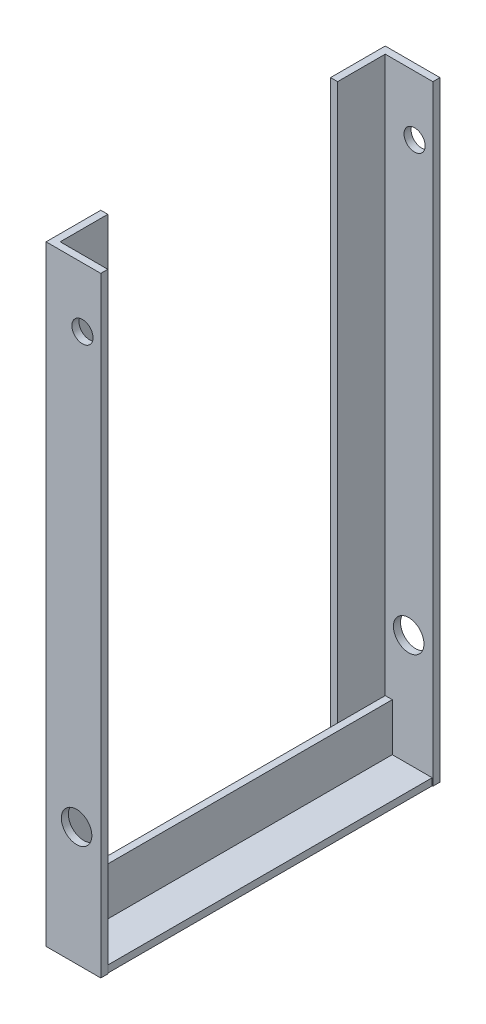
ISO-10303-21;
HEADER;
FILE_DESCRIPTION(('STEP AP214'),'2;1');
FILE_NAME('part.step','',(''),(''),'','','');
FILE_SCHEMA(('AUTOMOTIVE_DESIGN { 1 0 10303 214 1 1 1 1 }'));
ENDSEC;
DATA;
#1=APPLICATION_CONTEXT('core data for automotive mechanical design processes');
#2=APPLICATION_PROTOCOL_DEFINITION('international standard','automotive_design',2000,#1);
#3=PRODUCT_CONTEXT('',#1,'mechanical');
#4=PRODUCT('Part','Part','',(#3));
#5=PRODUCT_RELATED_PRODUCT_CATEGORY('part','',(#4));
#6=PRODUCT_DEFINITION_FORMATION('','',#4);
#7=PRODUCT_DEFINITION_CONTEXT('part definition',#1,'design');
#8=PRODUCT_DEFINITION('design','',#6,#7);
#9=PRODUCT_DEFINITION_SHAPE('','',#8);
#10=(LENGTH_UNIT() NAMED_UNIT(*) SI_UNIT(.MILLI.,.METRE.));
#11=(NAMED_UNIT(*) PLANE_ANGLE_UNIT() SI_UNIT($,.RADIAN.));
#12=(NAMED_UNIT(*) SI_UNIT($,.STERADIAN.) SOLID_ANGLE_UNIT());
#13=UNCERTAINTY_MEASURE_WITH_UNIT(LENGTH_MEASURE(1.E-05),#10,'distance_accuracy_value','');
#14=(GEOMETRIC_REPRESENTATION_CONTEXT(3) GLOBAL_UNCERTAINTY_ASSIGNED_CONTEXT((#13)) GLOBAL_UNIT_ASSIGNED_CONTEXT((#10,
#11,#12)) REPRESENTATION_CONTEXT('',''));
#15=CARTESIAN_POINT('',(0.,0.,0.));
#16=DIRECTION('',(0.,0.,1.));
#17=DIRECTION('',(1.,0.,0.));
#18=AXIS2_PLACEMENT_3D('',#15,#16,#17);
#19=CARTESIAN_POINT('',(6.00000000000002,0.,0.));
#20=DIRECTION('',(-1.,0.,0.));
#21=DIRECTION('',(0.,-1.,0.));
#22=AXIS2_PLACEMENT_3D('',#19,#20,#21);
#23=PLANE('',#22);
#24=DIRECTION('',(0.,0.,1.));
#25=VECTOR('',#24,1.);
#26=CARTESIAN_POINT('',(6.00000000000003,-127.,1.49999999999997));
#27=LINE('',#26,#25);
#28=CARTESIAN_POINT('',(6.00000000000003,-127.,1.49999999999997));
#29=VERTEX_POINT('',#28);
#30=CARTESIAN_POINT('',(6.00000000000003,-127.,140.));
#31=VERTEX_POINT('',#30);
#32=EDGE_CURVE('E168',#29,#31,#27,.T.);
#33=ORIENTED_EDGE('',*,*,#32,.F.);
#34=DIRECTION('',(0.,-1.,0.));
#35=VECTOR('',#34,1.);
#36=CARTESIAN_POINT('',(6.00000000000002,0.,1.5));
#37=LINE('',#36,#35);
#38=CARTESIAN_POINT('',(6.00000000000003,-106.7,1.49999999999997));
#39=VERTEX_POINT('',#38);
#40=EDGE_CURVE('E11',#39,#29,#37,.T.);
#41=ORIENTED_EDGE('',*,*,#40,.F.);
#42=DIRECTION('',(0.,0.,1.));
#43=VECTOR('',#42,1.);
#44=CARTESIAN_POINT('',(6.00000000000003,-106.7,143.));
#45=LINE('',#44,#43);
#46=CARTESIAN_POINT('',(6.00000000000003,-106.7,140.));
#47=VERTEX_POINT('',#46);
#48=EDGE_CURVE('E202',#39,#47,#45,.T.);
#49=ORIENTED_EDGE('',*,*,#48,.T.);
#50=DIRECTION('',(0.,1.,0.));
#51=VECTOR('',#50,1.);
#52=CARTESIAN_POINT('',(6.00000000000002,0.,140.));
#53=LINE('',#52,#51);
#54=EDGE_CURVE('E42',#31,#47,#53,.T.);
#55=ORIENTED_EDGE('',*,*,#54,.F.);
#56=EDGE_LOOP('',(#33,#41,#49,#55));
#57=FACE_BOUND('',#56,.T.);
#58=ADVANCED_FACE('F33',(#57),#23,.F.);
#59=CARTESIAN_POINT('',(0.,0.,140.));
#60=DIRECTION('',(0.,0.,-1.));
#61=DIRECTION('',(-1.,0.,0.));
#62=AXIS2_PLACEMENT_3D('',#59,#60,#61);
#63=PLANE('',#62);
#64=CARTESIAN_POINT('',(15.5,104.6,140.));
#65=DIRECTION('',(0.,0.,-1.));
#66=DIRECTION('',(-1.,0.,0.));
#67=AXIS2_PLACEMENT_3D('',#64,#65,#66);
#68=CIRCLE('',#67,4.5);
#69=CARTESIAN_POINT('',(11.,104.6,140.));
#70=VERTEX_POINT('',#69);
#71=EDGE_CURVE('E327',#70,#70,#68,.T.);
#72=ORIENTED_EDGE('',*,*,#71,.F.);
#73=EDGE_LOOP('',(#72));
#74=FACE_BOUND('',#73,.T.);
#75=CARTESIAN_POINT('',(13.,-79.4000000000002,140.));
#76=DIRECTION('',(0.,0.,-1.));
#77=DIRECTION('',(-1.,0.,0.));
#78=AXIS2_PLACEMENT_3D('',#75,#76,#77);
#79=CIRCLE('',#78,6.50000000000002);
#80=CARTESIAN_POINT('',(6.49999999999998,-79.4000000000002,140.));
#81=VERTEX_POINT('',#80);
#82=EDGE_CURVE('E312',#81,#81,#79,.T.);
#83=ORIENTED_EDGE('',*,*,#82,.F.);
#84=EDGE_LOOP('',(#83));
#85=FACE_BOUND('',#84,.T.);
#86=DIRECTION('',(0.,-1.,0.));
#87=VECTOR('',#86,1.);
#88=CARTESIAN_POINT('',(23.,-130.,140.));
#89=LINE('',#88,#87);
#90=CARTESIAN_POINT('',(23.,-127.,140.));
#91=VERTEX_POINT('',#90);
#92=CARTESIAN_POINT('',(23.,-130.,140.));
#93=VERTEX_POINT('',#92);
#94=EDGE_CURVE('E162',#91,#93,#89,.T.);
#95=ORIENTED_EDGE('',*,*,#94,.F.);
#96=DIRECTION('',(-1.,0.,0.));
#97=VECTOR('',#96,1.);
#98=CARTESIAN_POINT('',(23.,-127.,140.));
#99=LINE('',#98,#97);
#100=EDGE_CURVE('E160',#91,#31,#99,.T.);
#101=ORIENTED_EDGE('',*,*,#100,.T.);
#102=ORIENTED_EDGE('',*,*,#54,.T.);
#103=DIRECTION('',(-1.,0.,0.));
#104=VECTOR('',#103,1.);
#105=CARTESIAN_POINT('',(0.,-106.7,140.));
#106=LINE('',#105,#104);
#107=CARTESIAN_POINT('',(3.00000000000003,-106.7,140.));
#108=VERTEX_POINT('',#107);
#109=EDGE_CURVE('E212',#47,#108,#106,.T.);
#110=ORIENTED_EDGE('',*,*,#109,.T.);
#111=DIRECTION('',(0.,-1.,0.));
#112=VECTOR('',#111,1.);
#113=CARTESIAN_POINT('',(3.00000000000002,0.,140.));
#114=LINE('',#113,#112);
#115=CARTESIAN_POINT('',(3.,130.,140.));
#116=VERTEX_POINT('',#115);
#117=EDGE_CURVE('E256',#116,#108,#114,.T.);
#118=ORIENTED_EDGE('',*,*,#117,.F.);
#119=DIRECTION('',(-1.,0.,0.));
#120=VECTOR('',#119,1.);
#121=CARTESIAN_POINT('',(0.,130.,140.));
#122=LINE('',#121,#120);
#123=CARTESIAN_POINT('',(23.3,130.,140.));
#124=VERTEX_POINT('',#123);
#125=EDGE_CURVE('E243',#124,#116,#122,.T.);
#126=ORIENTED_EDGE('',*,*,#125,.F.);
#127=DIRECTION('',(0.,1.,0.));
#128=VECTOR('',#127,1.);
#129=CARTESIAN_POINT('',(23.3,-130.,140.));
#130=LINE('',#129,#128);
#131=CARTESIAN_POINT('',(23.3,-130.,140.));
#132=VERTEX_POINT('',#131);
#133=EDGE_CURVE('E229',#132,#124,#130,.T.);
#134=ORIENTED_EDGE('',*,*,#133,.F.);
#135=DIRECTION('',(1.,0.,0.));
#136=VECTOR('',#135,1.);
#137=CARTESIAN_POINT('',(0.,-130.,140.));
#138=LINE('',#137,#136);
#139=EDGE_CURVE('E234',#93,#132,#138,.T.);
#140=ORIENTED_EDGE('',*,*,#139,.F.);
#141=EDGE_LOOP('',(#95,#101,#102,#110,#118,#126,#134,#140));
#142=FACE_BOUND('',#141,.T.);
#143=ADVANCED_FACE('F261',(#74,#85,#142),#63,.T.);
#144=CARTESIAN_POINT('',(3.,130.,1.50000000000001));
#145=DIRECTION('',(0.,0.,-1.));
#146=DIRECTION('',(0.,1.,0.));
#147=AXIS2_PLACEMENT_3D('',#144,#145,#146);
#148=PLANE('',#147);
#149=CARTESIAN_POINT('',(13.,-79.4000000000002,1.49999999999997));
#150=DIRECTION('',(0.,0.,-1.));
#151=DIRECTION('',(0.,1.,0.));
#152=AXIS2_PLACEMENT_3D('',#149,#150,#151);
#153=CIRCLE('',#152,6.50000000000002);
#154=CARTESIAN_POINT('',(13.,-72.9000000000002,1.49999999999997));
#155=VERTEX_POINT('',#154);
#156=EDGE_CURVE('E314',#155,#155,#153,.T.);
#157=ORIENTED_EDGE('',*,*,#156,.T.);
#158=EDGE_LOOP('',(#157));
#159=FACE_BOUND('',#158,.T.);
#160=CARTESIAN_POINT('',(15.5,104.6,1.50000000000001));
#161=DIRECTION('',(0.,0.,-1.));
#162=DIRECTION('',(0.,1.,0.));
#163=AXIS2_PLACEMENT_3D('',#160,#161,#162);
#164=CIRCLE('',#163,4.5);
#165=CARTESIAN_POINT('',(15.5,109.1,1.50000000000001));
#166=VERTEX_POINT('',#165);
#167=EDGE_CURVE('E597',#166,#166,#164,.F.);
#168=ORIENTED_EDGE('',*,*,#167,.F.);
#169=EDGE_LOOP('',(#168));
#170=FACE_BOUND('',#169,.T.);
#171=DIRECTION('',(-1.,0.,0.));
#172=VECTOR('',#171,1.);
#173=CARTESIAN_POINT('',(23.,-127.,1.49999999999997));
#174=LINE('',#173,#172);
#175=CARTESIAN_POINT('',(23.,-127.,1.49999999999997));
#176=VERTEX_POINT('',#175);
#177=EDGE_CURVE('E157',#176,#29,#174,.T.);
#178=ORIENTED_EDGE('',*,*,#177,.F.);
#179=DIRECTION('',(0.,1.,0.));
#180=VECTOR('',#179,1.);
#181=CARTESIAN_POINT('',(23.,-130.,1.49999999999997));
#182=LINE('',#181,#180);
#183=CARTESIAN_POINT('',(23.,-130.,1.49999999999998));
#184=VERTEX_POINT('',#183);
#185=EDGE_CURVE('E163',#184,#176,#182,.T.);
#186=ORIENTED_EDGE('',*,*,#185,.F.);
#187=DIRECTION('',(-1.,0.,0.));
#188=VECTOR('',#187,1.);
#189=CARTESIAN_POINT('',(3.,-130.,1.49999999999998));
#190=LINE('',#189,#188);
#191=CARTESIAN_POINT('',(23.3,-130.,1.49999999999998));
#192=VERTEX_POINT('',#191);
#193=EDGE_CURVE('E309',#192,#184,#190,.T.);
#194=ORIENTED_EDGE('',*,*,#193,.F.);
#195=DIRECTION('',(0.,-1.,0.));
#196=VECTOR('',#195,1.);
#197=CARTESIAN_POINT('',(23.3,130.,1.50000000000001));
#198=LINE('',#197,#196);
#199=CARTESIAN_POINT('',(23.3,130.,1.50000000000001));
#200=VERTEX_POINT('',#199);
#201=EDGE_CURVE('E602',#200,#192,#198,.T.);
#202=ORIENTED_EDGE('',*,*,#201,.F.);
#203=DIRECTION('',(-1.,0.,0.));
#204=VECTOR('',#203,1.);
#205=CARTESIAN_POINT('',(3.,130.,1.50000000000001));
#206=LINE('',#205,#204);
#207=CARTESIAN_POINT('',(3.,130.,1.5));
#208=VERTEX_POINT('',#207);
#209=EDGE_CURVE('E587',#200,#208,#206,.T.);
#210=ORIENTED_EDGE('',*,*,#209,.T.);
#211=DIRECTION('',(0.,1.,0.));
#212=VECTOR('',#211,1.);
#213=CARTESIAN_POINT('',(3.,130.,1.5));
#214=LINE('',#213,#212);
#215=CARTESIAN_POINT('',(3.00000000000003,-106.7,1.5));
#216=VERTEX_POINT('',#215);
#217=EDGE_CURVE('E172',#216,#208,#214,.T.);
#218=ORIENTED_EDGE('',*,*,#217,.F.);
#219=DIRECTION('',(1.,0.,0.));
#220=VECTOR('',#219,1.);
#221=CARTESIAN_POINT('',(6.00000000000003,-106.7,1.49999999999997));
#222=LINE('',#221,#220);
#223=EDGE_CURVE('E198',#216,#39,#222,.T.);
#224=ORIENTED_EDGE('',*,*,#223,.T.);
#225=ORIENTED_EDGE('',*,*,#40,.T.);
#226=EDGE_LOOP('',(#178,#186,#194,#202,#210,#218,#224,#225));
#227=FACE_BOUND('',#226,.T.);
#228=ADVANCED_FACE('F170',(#159,#170,#227),#148,.F.);
#229=CARTESIAN_POINT('',(6.00000000000003,-106.7,143.));
#230=DIRECTION('',(0.,-1.,0.));
#231=DIRECTION('',(1.,0.,0.));
#232=AXIS2_PLACEMENT_3D('',#229,#230,#231);
#233=PLANE('',#232);
#234=ORIENTED_EDGE('',*,*,#223,.F.);
#235=DIRECTION('',(0.,0.,1.));
#236=VECTOR('',#235,1.);
#237=CARTESIAN_POINT('',(3.00000000000003,-106.7,143.));
#238=LINE('',#237,#236);
#239=CARTESIAN_POINT('',(3.00000000000003,-106.7,21.8));
#240=VERTEX_POINT('',#239);
#241=EDGE_CURVE('E206',#216,#240,#238,.T.);
#242=ORIENTED_EDGE('',*,*,#241,.T.);
#243=CARTESIAN_POINT('',(3.00000000000003,-106.7,119.7));
#244=VERTEX_POINT('',#243);
#245=EDGE_CURVE('E209',#240,#244,#238,.T.);
#246=ORIENTED_EDGE('',*,*,#245,.T.);
#247=EDGE_CURVE('E208',#244,#108,#238,.T.);
#248=ORIENTED_EDGE('',*,*,#247,.T.);
#249=ORIENTED_EDGE('',*,*,#109,.F.);
#250=ORIENTED_EDGE('',*,*,#48,.F.);
#251=EDGE_LOOP('',(#234,#242,#246,#248,#249,#250));
#252=FACE_BOUND('',#251,.T.);
#253=ADVANCED_FACE('F268',(#252),#233,.F.);
#254=CARTESIAN_POINT('',(3.,130.,119.7));
#255=DIRECTION('',(1.,0.,0.));
#256=DIRECTION('',(0.,1.,0.));
#257=AXIS2_PLACEMENT_3D('',#254,#255,#256);
#258=PLANE('',#257);
#259=ORIENTED_EDGE('',*,*,#117,.T.);
#260=ORIENTED_EDGE('',*,*,#247,.F.);
#261=DIRECTION('',(0.,1.,0.));
#262=VECTOR('',#261,1.);
#263=CARTESIAN_POINT('',(3.,130.,119.7));
#264=LINE('',#263,#262);
#265=CARTESIAN_POINT('',(3.,130.,119.7));
#266=VERTEX_POINT('',#265);
#267=EDGE_CURVE('E220',#244,#266,#264,.T.);
#268=ORIENTED_EDGE('',*,*,#267,.T.);
#269=DIRECTION('',(0.,0.,1.));
#270=VECTOR('',#269,1.);
#271=CARTESIAN_POINT('',(3.,130.,119.7));
#272=LINE('',#271,#270);
#273=EDGE_CURVE('E227',#266,#116,#272,.T.);
#274=ORIENTED_EDGE('',*,*,#273,.T.);
#275=EDGE_LOOP('',(#259,#260,#268,#274));
#276=FACE_BOUND('',#275,.T.);
#277=ADVANCED_FACE('F297',(#276),#258,.T.);
#278=CARTESIAN_POINT('',(23.3,-130.,143.));
#279=DIRECTION('',(-1.,0.,0.));
#280=DIRECTION('',(0.,0.,1.));
#281=AXIS2_PLACEMENT_3D('',#278,#279,#280);
#282=PLANE('',#281);
#283=ORIENTED_EDGE('',*,*,#133,.T.);
#284=DIRECTION('',(0.,0.,-1.));
#285=VECTOR('',#284,1.);
#286=CARTESIAN_POINT('',(23.3,130.,143.));
#287=LINE('',#286,#285);
#288=CARTESIAN_POINT('',(23.3,130.,143.));
#289=VERTEX_POINT('',#288);
#290=EDGE_CURVE('E253',#289,#124,#287,.T.);
#291=ORIENTED_EDGE('',*,*,#290,.F.);
#292=DIRECTION('',(0.,1.,0.));
#293=VECTOR('',#292,1.);
#294=CARTESIAN_POINT('',(23.3,-130.,143.));
#295=LINE('',#294,#293);
#296=CARTESIAN_POINT('',(23.3,-130.,143.));
#297=VERTEX_POINT('',#296);
#298=EDGE_CURVE('E230',#297,#289,#295,.T.);
#299=ORIENTED_EDGE('',*,*,#298,.F.);
#300=DIRECTION('',(0.,0.,-1.));
#301=VECTOR('',#300,1.);
#302=CARTESIAN_POINT('',(23.3,-130.,143.));
#303=LINE('',#302,#301);
#304=EDGE_CURVE('E240',#297,#132,#303,.T.);
#305=ORIENTED_EDGE('',*,*,#304,.T.);
#306=EDGE_LOOP('',(#283,#291,#299,#305));
#307=FACE_BOUND('',#306,.T.);
#308=ADVANCED_FACE('F35',(#307),#282,.F.);
#309=CARTESIAN_POINT('',(0.,130.,143.));
#310=DIRECTION('',(0.,-1.,0.));
#311=DIRECTION('',(0.,0.,-1.));
#312=AXIS2_PLACEMENT_3D('',#309,#310,#311);
#313=PLANE('',#312);
#314=ORIENTED_EDGE('',*,*,#125,.T.);
#315=ORIENTED_EDGE('',*,*,#273,.F.);
#316=DIRECTION('',(-1.,0.,0.));
#317=VECTOR('',#316,1.);
#318=CARTESIAN_POINT('',(0.,130.,119.7));
#319=LINE('',#318,#317);
#320=CARTESIAN_POINT('',(0.,130.,119.7));
#321=VERTEX_POINT('',#320);
#322=EDGE_CURVE('E224',#266,#321,#319,.T.);
#323=ORIENTED_EDGE('',*,*,#322,.T.);
#324=DIRECTION('',(0.,0.,-1.));
#325=VECTOR('',#324,1.);
#326=CARTESIAN_POINT('',(0.,130.,143.));
#327=LINE('',#326,#325);
#328=CARTESIAN_POINT('',(0.,130.,143.));
#329=VERTEX_POINT('',#328);
#330=EDGE_CURVE('E251',#329,#321,#327,.T.);
#331=ORIENTED_EDGE('',*,*,#330,.F.);
#332=DIRECTION('',(-1.,0.,0.));
#333=VECTOR('',#332,1.);
#334=CARTESIAN_POINT('',(0.,130.,143.));
#335=LINE('',#334,#333);
#336=EDGE_CURVE('E233',#289,#329,#335,.T.);
#337=ORIENTED_EDGE('',*,*,#336,.F.);
#338=ORIENTED_EDGE('',*,*,#290,.T.);
#339=EDGE_LOOP('',(#314,#315,#323,#331,#337,#338));
#340=FACE_BOUND('',#339,.T.);
#341=ADVANCED_FACE('F299',(#340),#313,.F.);
#342=CARTESIAN_POINT('',(0.,-130.,143.));
#343=DIRECTION('',(1.,0.,0.));
#344=DIRECTION('',(0.,0.,-1.));
#345=AXIS2_PLACEMENT_3D('',#342,#343,#344);
#346=PLANE('',#345);
#347=ORIENTED_EDGE('',*,*,#330,.T.);
#348=DIRECTION('',(0.,-1.,0.));
#349=VECTOR('',#348,1.);
#350=CARTESIAN_POINT('',(0.,130.,119.7));
#351=LINE('',#350,#349);
#352=CARTESIAN_POINT('',(0.,-130.,119.7));
#353=VERTEX_POINT('',#352);
#354=EDGE_CURVE('E214',#321,#353,#351,.T.);
#355=ORIENTED_EDGE('',*,*,#354,.T.);
#356=DIRECTION('',(0.,0.,-1.));
#357=VECTOR('',#356,1.);
#358=CARTESIAN_POINT('',(0.,-130.,143.));
#359=LINE('',#358,#357);
#360=CARTESIAN_POINT('',(0.,-130.,143.));
#361=VERTEX_POINT('',#360);
#362=EDGE_CURVE('E249',#361,#353,#359,.T.);
#363=ORIENTED_EDGE('',*,*,#362,.F.);
#364=DIRECTION('',(0.,-1.,0.));
#365=VECTOR('',#364,1.);
#366=CARTESIAN_POINT('',(0.,-130.,143.));
#367=LINE('',#366,#365);
#368=EDGE_CURVE('E236',#329,#361,#367,.T.);
#369=ORIENTED_EDGE('',*,*,#368,.F.);
#370=EDGE_LOOP('',(#347,#355,#363,#369));
#371=FACE_BOUND('',#370,.T.);
#372=ADVANCED_FACE('F373',(#371),#346,.F.);
#373=CARTESIAN_POINT('',(0.,-130.,143.));
#374=DIRECTION('',(0.,1.,0.));
#375=DIRECTION('',(0.,0.,1.));
#376=AXIS2_PLACEMENT_3D('',#373,#374,#375);
#377=PLANE('',#376);
#378=DIRECTION('',(0.,0.,-1.));
#379=VECTOR('',#378,1.);
#380=CARTESIAN_POINT('',(23.,-130.,1.49999999999997));
#381=LINE('',#380,#379);
#382=EDGE_CURVE('E49',#93,#184,#381,.T.);
#383=ORIENTED_EDGE('',*,*,#382,.F.);
#384=ORIENTED_EDGE('',*,*,#139,.T.);
#385=ORIENTED_EDGE('',*,*,#304,.F.);
#386=DIRECTION('',(1.,0.,0.));
#387=VECTOR('',#386,1.);
#388=CARTESIAN_POINT('',(0.,-130.,143.));
#389=LINE('',#388,#387);
#390=EDGE_CURVE('E238',#361,#297,#389,.T.);
#391=ORIENTED_EDGE('',*,*,#390,.F.);
#392=ORIENTED_EDGE('',*,*,#362,.T.);
#393=DIRECTION('',(1.,0.,0.));
#394=VECTOR('',#393,1.);
#395=CARTESIAN_POINT('',(0.,-130.,119.7));
#396=LINE('',#395,#394);
#397=CARTESIAN_POINT('',(3.00000000000003,-130.,119.7));
#398=VERTEX_POINT('',#397);
#399=EDGE_CURVE('E217',#353,#398,#396,.T.);
#400=ORIENTED_EDGE('',*,*,#399,.T.);
#401=DIRECTION('',(0.,0.,-1.));
#402=VECTOR('',#401,1.);
#403=CARTESIAN_POINT('',(3.00000000000003,-130.,143.));
#404=LINE('',#403,#402);
#405=CARTESIAN_POINT('',(3.00000000000003,-130.,21.8));
#406=VERTEX_POINT('',#405);
#407=EDGE_CURVE('E200',#398,#406,#404,.T.);
#408=ORIENTED_EDGE('',*,*,#407,.T.);
#409=DIRECTION('',(1.,0.,0.));
#410=VECTOR('',#409,1.);
#411=CARTESIAN_POINT('',(0.,-130.,21.8));
#412=LINE('',#411,#410);
#413=CARTESIAN_POINT('',(0.,-130.,21.8));
#414=VERTEX_POINT('',#413);
#415=EDGE_CURVE('E181',#414,#406,#412,.T.);
#416=ORIENTED_EDGE('',*,*,#415,.F.);
#417=DIRECTION('',(0.,0.,-1.));
#418=VECTOR('',#417,1.);
#419=CARTESIAN_POINT('',(0.,-130.,1.49999999999998));
#420=LINE('',#419,#418);
#421=CARTESIAN_POINT('',(0.,-130.,-1.50000000000002));
#422=VERTEX_POINT('',#421);
#423=EDGE_CURVE('E288',#414,#422,#420,.T.);
#424=ORIENTED_EDGE('',*,*,#423,.T.);
#425=DIRECTION('',(-1.,0.,0.));
#426=VECTOR('',#425,1.);
#427=CARTESIAN_POINT('',(6.00000000000003,-130.,-1.50000000000002));
#428=LINE('',#427,#426);
#429=CARTESIAN_POINT('',(23.3,-130.,-1.50000000000002));
#430=VERTEX_POINT('',#429);
#431=EDGE_CURVE('E205',#430,#422,#428,.T.);
#432=ORIENTED_EDGE('',*,*,#431,.F.);
#433=DIRECTION('',(0.,0.,-1.));
#434=VECTOR('',#433,1.);
#435=CARTESIAN_POINT('',(23.3,-130.,1.49999999999998));
#436=LINE('',#435,#434);
#437=EDGE_CURVE('E606',#192,#430,#436,.T.);
#438=ORIENTED_EDGE('',*,*,#437,.F.);
#439=ORIENTED_EDGE('',*,*,#193,.T.);
#440=EDGE_LOOP('',(#383,#384,#385,#391,#392,#400,#408,#416,#424,#432,#438,#439));
#441=FACE_BOUND('',#440,.T.);
#442=ADVANCED_FACE('F287',(#441),#377,.F.);
#443=CARTESIAN_POINT('',(0.,0.,143.));
#444=DIRECTION('',(0.,0.,-1.));
#445=DIRECTION('',(-1.,0.,0.));
#446=AXIS2_PLACEMENT_3D('',#443,#444,#445);
#447=PLANE('',#446);
#448=CARTESIAN_POINT('',(15.5,104.6,143.));
#449=DIRECTION('',(0.,0.,-1.));
#450=DIRECTION('',(-1.,0.,0.));
#451=AXIS2_PLACEMENT_3D('',#448,#449,#450);
#452=CIRCLE('',#451,4.5);
#453=CARTESIAN_POINT('',(11.,104.6,143.));
#454=VERTEX_POINT('',#453);
#455=EDGE_CURVE('E37',#454,#454,#452,.T.);
#456=ORIENTED_EDGE('',*,*,#455,.T.);
#457=EDGE_LOOP('',(#456));
#458=FACE_BOUND('',#457,.T.);
#459=CARTESIAN_POINT('',(13.,-79.4000000000002,143.));
#460=DIRECTION('',(0.,0.,-1.));
#461=DIRECTION('',(-1.,0.,0.));
#462=AXIS2_PLACEMENT_3D('',#459,#460,#461);
#463=CIRCLE('',#462,6.50000000000002);
#464=CARTESIAN_POINT('',(6.49999999999998,-79.4000000000002,143.));
#465=VERTEX_POINT('',#464);
#466=EDGE_CURVE('E319',#465,#465,#463,.T.);
#467=ORIENTED_EDGE('',*,*,#466,.T.);
#468=EDGE_LOOP('',(#467));
#469=FACE_BOUND('',#468,.T.);
#470=ORIENTED_EDGE('',*,*,#390,.T.);
#471=ORIENTED_EDGE('',*,*,#298,.T.);
#472=ORIENTED_EDGE('',*,*,#336,.T.);
#473=ORIENTED_EDGE('',*,*,#368,.T.);
#474=EDGE_LOOP('',(#470,#471,#472,#473));
#475=FACE_BOUND('',#474,.T.);
#476=ADVANCED_FACE('F334',(#458,#469,#475),#447,.F.);
#477=CARTESIAN_POINT('',(0.,0.,119.7));
#478=DIRECTION('',(0.,0.,1.));
#479=DIRECTION('',(1.,0.,0.));
#480=AXIS2_PLACEMENT_3D('',#477,#478,#479);
#481=PLANE('',#480);
#482=ORIENTED_EDGE('',*,*,#354,.F.);
#483=ORIENTED_EDGE('',*,*,#322,.F.);
#484=ORIENTED_EDGE('',*,*,#267,.F.);
#485=EDGE_CURVE('E221',#398,#244,#264,.T.);
#486=ORIENTED_EDGE('',*,*,#485,.F.);
#487=ORIENTED_EDGE('',*,*,#399,.F.);
#488=EDGE_LOOP('',(#482,#483,#484,#486,#487));
#489=FACE_BOUND('',#488,.T.);
#490=ADVANCED_FACE('F294',(#489),#481,.F.);
#491=CARTESIAN_POINT('',(3.00000000000001,0.,0.));
#492=DIRECTION('',(-1.,0.,0.));
#493=DIRECTION('',(0.,-1.,0.));
#494=AXIS2_PLACEMENT_3D('',#491,#492,#493);
#495=PLANE('',#494);
#496=DIRECTION('',(0.,1.,0.));
#497=VECTOR('',#496,1.);
#498=CARTESIAN_POINT('',(3.,130.,21.8));
#499=LINE('',#498,#497);
#500=EDGE_CURVE('E57',#406,#240,#499,.T.);
#501=ORIENTED_EDGE('',*,*,#500,.F.);
#502=ORIENTED_EDGE('',*,*,#407,.F.);
#503=ORIENTED_EDGE('',*,*,#485,.T.);
#504=ORIENTED_EDGE('',*,*,#245,.F.);
#505=EDGE_LOOP('',(#501,#502,#503,#504));
#506=FACE_BOUND('',#505,.T.);
#507=ADVANCED_FACE('F291',(#506),#495,.T.);
#508=CARTESIAN_POINT('',(6.00000000000003,-130.,-1.50000000000002));
#509=DIRECTION('',(0.,0.,1.));
#510=DIRECTION('',(0.,-1.,0.));
#511=AXIS2_PLACEMENT_3D('',#508,#509,#510);
#512=PLANE('',#511);
#513=CARTESIAN_POINT('',(13.,-79.4000000000002,-1.50000000000001));
#514=DIRECTION('',(0.,0.,-1.));
#515=DIRECTION('',(0.,1.,0.));
#516=AXIS2_PLACEMENT_3D('',#513,#514,#515);
#517=CIRCLE('',#516,6.50000000000002);
#518=CARTESIAN_POINT('',(13.,-72.9000000000002,-1.50000000000001));
#519=VERTEX_POINT('',#518);
#520=EDGE_CURVE('E324',#519,#519,#517,.T.);
#521=ORIENTED_EDGE('',*,*,#520,.F.);
#522=EDGE_LOOP('',(#521));
#523=FACE_BOUND('',#522,.T.);
#524=ORIENTED_EDGE('',*,*,#431,.T.);
#525=DIRECTION('',(0.,1.,0.));
#526=VECTOR('',#525,1.);
#527=CARTESIAN_POINT('',(0.,130.,-1.49999999999998));
#528=LINE('',#527,#526);
#529=CARTESIAN_POINT('',(0.,130.,-1.49999999999998));
#530=VERTEX_POINT('',#529);
#531=EDGE_CURVE('E584',#422,#530,#528,.T.);
#532=ORIENTED_EDGE('',*,*,#531,.T.);
#533=DIRECTION('',(-1.,0.,0.));
#534=VECTOR('',#533,1.);
#535=CARTESIAN_POINT('',(3.,130.,-1.49999999999998));
#536=LINE('',#535,#534);
#537=CARTESIAN_POINT('',(23.3,130.,-1.49999999999999));
#538=VERTEX_POINT('',#537);
#539=EDGE_CURVE('E201',#538,#530,#536,.T.);
#540=ORIENTED_EDGE('',*,*,#539,.F.);
#541=DIRECTION('',(0.,1.,0.));
#542=VECTOR('',#541,1.);
#543=CARTESIAN_POINT('',(23.3,130.,-1.49999999999999));
#544=LINE('',#543,#542);
#545=EDGE_CURVE('E610',#430,#538,#544,.T.);
#546=ORIENTED_EDGE('',*,*,#545,.F.);
#547=EDGE_LOOP('',(#524,#532,#540,#546));
#548=FACE_BOUND('',#547,.T.);
#549=CARTESIAN_POINT('',(15.5,104.6,-1.49999999999999));
#550=DIRECTION('',(0.,0.,1.));
#551=DIRECTION('',(0.,-1.,0.));
#552=AXIS2_PLACEMENT_3D('',#549,#550,#551);
#553=CIRCLE('',#552,4.5);
#554=CARTESIAN_POINT('',(15.5,100.1,-1.49999999999999));
#555=VERTEX_POINT('',#554);
#556=EDGE_CURVE('E192',#555,#555,#553,.F.);
#557=ORIENTED_EDGE('',*,*,#556,.F.);
#558=EDGE_LOOP('',(#557));
#559=FACE_BOUND('',#558,.T.);
#560=ADVANCED_FACE('F359',(#523,#548,#559),#512,.F.);
#561=CARTESIAN_POINT('',(3.,130.,21.8));
#562=DIRECTION('',(-1.,0.,0.));
#563=DIRECTION('',(0.,-1.,0.));
#564=AXIS2_PLACEMENT_3D('',#561,#562,#563);
#565=PLANE('',#564);
#566=CARTESIAN_POINT('',(3.,130.,21.8));
#567=VERTEX_POINT('',#566);
#568=EDGE_CURVE('E184',#240,#567,#499,.T.);
#569=ORIENTED_EDGE('',*,*,#568,.F.);
#570=ORIENTED_EDGE('',*,*,#241,.F.);
#571=ORIENTED_EDGE('',*,*,#217,.T.);
#572=DIRECTION('',(0.,0.,-1.));
#573=VECTOR('',#572,1.);
#574=CARTESIAN_POINT('',(3.,130.,21.8));
#575=LINE('',#574,#573);
#576=EDGE_CURVE('E189',#567,#208,#575,.T.);
#577=ORIENTED_EDGE('',*,*,#576,.F.);
#578=EDGE_LOOP('',(#569,#570,#571,#577));
#579=FACE_BOUND('',#578,.T.);
#580=ADVANCED_FACE('F278',(#579),#565,.F.);
#581=CARTESIAN_POINT('',(3.,130.,1.50000000000001));
#582=DIRECTION('',(0.,-1.,0.));
#583=DIRECTION('',(0.,0.,-1.));
#584=AXIS2_PLACEMENT_3D('',#581,#582,#583);
#585=PLANE('',#584);
#586=DIRECTION('',(0.,0.,1.));
#587=VECTOR('',#586,1.);
#588=CARTESIAN_POINT('',(0.,130.,1.50000000000001));
#589=LINE('',#588,#587);
#590=CARTESIAN_POINT('',(0.,130.,21.8));
#591=VERTEX_POINT('',#590);
#592=EDGE_CURVE('E581',#530,#591,#589,.T.);
#593=ORIENTED_EDGE('',*,*,#592,.T.);
#594=DIRECTION('',(-1.,0.,0.));
#595=VECTOR('',#594,1.);
#596=CARTESIAN_POINT('',(0.,130.,21.8));
#597=LINE('',#596,#595);
#598=EDGE_CURVE('E186',#567,#591,#597,.T.);
#599=ORIENTED_EDGE('',*,*,#598,.F.);
#600=ORIENTED_EDGE('',*,*,#576,.T.);
#601=ORIENTED_EDGE('',*,*,#209,.F.);
#602=DIRECTION('',(0.,0.,1.));
#603=VECTOR('',#602,1.);
#604=CARTESIAN_POINT('',(23.3,130.,1.50000000000001));
#605=LINE('',#604,#603);
#606=EDGE_CURVE('E615',#538,#200,#605,.T.);
#607=ORIENTED_EDGE('',*,*,#606,.F.);
#608=ORIENTED_EDGE('',*,*,#539,.T.);
#609=EDGE_LOOP('',(#593,#599,#600,#601,#607,#608));
#610=FACE_BOUND('',#609,.T.);
#611=ADVANCED_FACE('F355',(#610),#585,.F.);
#612=CARTESIAN_POINT('',(0.,0.,0.));
#613=DIRECTION('',(1.,0.,0.));
#614=DIRECTION('',(0.,0.,-1.));
#615=AXIS2_PLACEMENT_3D('',#612,#613,#614);
#616=PLANE('',#615);
#617=ORIENTED_EDGE('',*,*,#531,.F.);
#618=ORIENTED_EDGE('',*,*,#423,.F.);
#619=DIRECTION('',(0.,-1.,0.));
#620=VECTOR('',#619,1.);
#621=CARTESIAN_POINT('',(0.,130.,21.8));
#622=LINE('',#621,#620);
#623=EDGE_CURVE('E174',#591,#414,#622,.T.);
#624=ORIENTED_EDGE('',*,*,#623,.F.);
#625=ORIENTED_EDGE('',*,*,#592,.F.);
#626=EDGE_LOOP('',(#617,#618,#624,#625));
#627=FACE_BOUND('',#626,.T.);
#628=ADVANCED_FACE('F484',(#627),#616,.F.);
#629=CARTESIAN_POINT('',(23.3,0.,0.));
#630=DIRECTION('',(1.,0.,0.));
#631=DIRECTION('',(0.,0.,-1.));
#632=AXIS2_PLACEMENT_3D('',#629,#630,#631);
#633=PLANE('',#632);
#634=ORIENTED_EDGE('',*,*,#201,.T.);
#635=ORIENTED_EDGE('',*,*,#437,.T.);
#636=ORIENTED_EDGE('',*,*,#545,.T.);
#637=ORIENTED_EDGE('',*,*,#606,.T.);
#638=EDGE_LOOP('',(#634,#635,#636,#637));
#639=FACE_BOUND('',#638,.T.);
#640=ADVANCED_FACE('F474',(#639),#633,.T.);
#641=CARTESIAN_POINT('',(15.5,104.6,23.8));
#642=DIRECTION('',(0.,0.,-1.));
#643=DIRECTION('',(-1.,0.,0.));
#644=AXIS2_PLACEMENT_3D('',#641,#642,#643);
#645=CYLINDRICAL_SURFACE('',#644,4.5);
#646=ORIENTED_EDGE('',*,*,#167,.T.);
#647=EDGE_LOOP('',(#646));
#648=FACE_BOUND('',#647,.T.);
#649=ORIENTED_EDGE('',*,*,#556,.T.);
#650=EDGE_LOOP('',(#649));
#651=FACE_BOUND('',#650,.T.);
#652=ADVANCED_FACE('F464',(#648,#651),#645,.F.);
#653=CARTESIAN_POINT('',(0.,0.,21.8));
#654=DIRECTION('',(0.,0.,1.));
#655=DIRECTION('',(1.,0.,0.));
#656=AXIS2_PLACEMENT_3D('',#653,#654,#655);
#657=PLANE('',#656);
#658=ORIENTED_EDGE('',*,*,#623,.T.);
#659=ORIENTED_EDGE('',*,*,#415,.T.);
#660=ORIENTED_EDGE('',*,*,#500,.T.);
#661=ORIENTED_EDGE('',*,*,#568,.T.);
#662=ORIENTED_EDGE('',*,*,#598,.T.);
#663=EDGE_LOOP('',(#658,#659,#660,#661,#662));
#664=FACE_BOUND('',#663,.T.);
#665=ADVANCED_FACE('F282',(#664),#657,.T.);
#666=CARTESIAN_POINT('',(23.,-127.,1.49999999999997));
#667=DIRECTION('',(0.,-1.,0.));
#668=DIRECTION('',(0.,0.,-1.));
#669=AXIS2_PLACEMENT_3D('',#666,#667,#668);
#670=PLANE('',#669);
#671=ORIENTED_EDGE('',*,*,#32,.T.);
#672=ORIENTED_EDGE('',*,*,#100,.F.);
#673=DIRECTION('',(0.,0.,1.));
#674=VECTOR('',#673,1.);
#675=CARTESIAN_POINT('',(23.,-127.,1.49999999999997));
#676=LINE('',#675,#674);
#677=EDGE_CURVE('E154',#176,#91,#676,.T.);
#678=ORIENTED_EDGE('',*,*,#677,.F.);
#679=ORIENTED_EDGE('',*,*,#177,.T.);
#680=EDGE_LOOP('',(#671,#672,#678,#679));
#681=FACE_BOUND('',#680,.T.);
#682=ADVANCED_FACE('F155',(#681),#670,.F.);
#683=CARTESIAN_POINT('',(23.,0.,0.));
#684=DIRECTION('',(1.,0.,0.));
#685=DIRECTION('',(0.,1.,0.));
#686=AXIS2_PLACEMENT_3D('',#683,#684,#685);
#687=PLANE('',#686);
#688=ORIENTED_EDGE('',*,*,#185,.T.);
#689=ORIENTED_EDGE('',*,*,#677,.T.);
#690=ORIENTED_EDGE('',*,*,#94,.T.);
#691=ORIENTED_EDGE('',*,*,#382,.T.);
#692=EDGE_LOOP('',(#688,#689,#690,#691));
#693=FACE_BOUND('',#692,.T.);
#694=ADVANCED_FACE('F165',(#693),#687,.T.);
#695=CARTESIAN_POINT('',(13.,-79.4000000000002,154.5));
#696=DIRECTION('',(0.,0.,-1.));
#697=DIRECTION('',(0.,1.,0.));
#698=AXIS2_PLACEMENT_3D('',#695,#696,#697);
#699=CYLINDRICAL_SURFACE('',#698,6.50000000000002);
#700=ORIENTED_EDGE('',*,*,#520,.T.);
#701=EDGE_LOOP('',(#700));
#702=FACE_BOUND('',#701,.T.);
#703=ORIENTED_EDGE('',*,*,#156,.F.);
#704=EDGE_LOOP('',(#703));
#705=FACE_BOUND('',#704,.T.);
#706=ADVANCED_FACE('F344',(#702,#705),#699,.F.);
#707=ORIENTED_EDGE('',*,*,#82,.T.);
#708=EDGE_LOOP('',(#707));
#709=FACE_BOUND('',#708,.T.);
#710=ORIENTED_EDGE('',*,*,#466,.F.);
#711=EDGE_LOOP('',(#710));
#712=FACE_BOUND('',#711,.T.);
#713=ADVANCED_FACE('F339',(#709,#712),#699,.F.);
#714=CARTESIAN_POINT('',(15.5,104.6,150.));
#715=DIRECTION('',(0.,0.,-1.));
#716=DIRECTION('',(-1.,0.,0.));
#717=AXIS2_PLACEMENT_3D('',#714,#715,#716);
#718=CYLINDRICAL_SURFACE('',#717,4.5);
#719=ORIENTED_EDGE('',*,*,#71,.T.);
#720=EDGE_LOOP('',(#719));
#721=FACE_BOUND('',#720,.T.);
#722=ORIENTED_EDGE('',*,*,#455,.F.);
#723=EDGE_LOOP('',(#722));
#724=FACE_BOUND('',#723,.T.);
#725=ADVANCED_FACE('F337',(#721,#724),#718,.F.);
#726=CLOSED_SHELL('',(#58,#143,#228,#253,#277,#308,#341,#372,#442,#476,#490,#507,#560,#580,#611,
#628,#640,#652,#665,#682,#694,#706,#713,#725));
#727=MANIFOLD_SOLID_BREP('B2',#726);
#728=ADVANCED_BREP_SHAPE_REPRESENTATION('',(#18,#727),#14);
#729=SHAPE_DEFINITION_REPRESENTATION(#9,#728);
ENDSEC;
END-ISO-10303-21;
